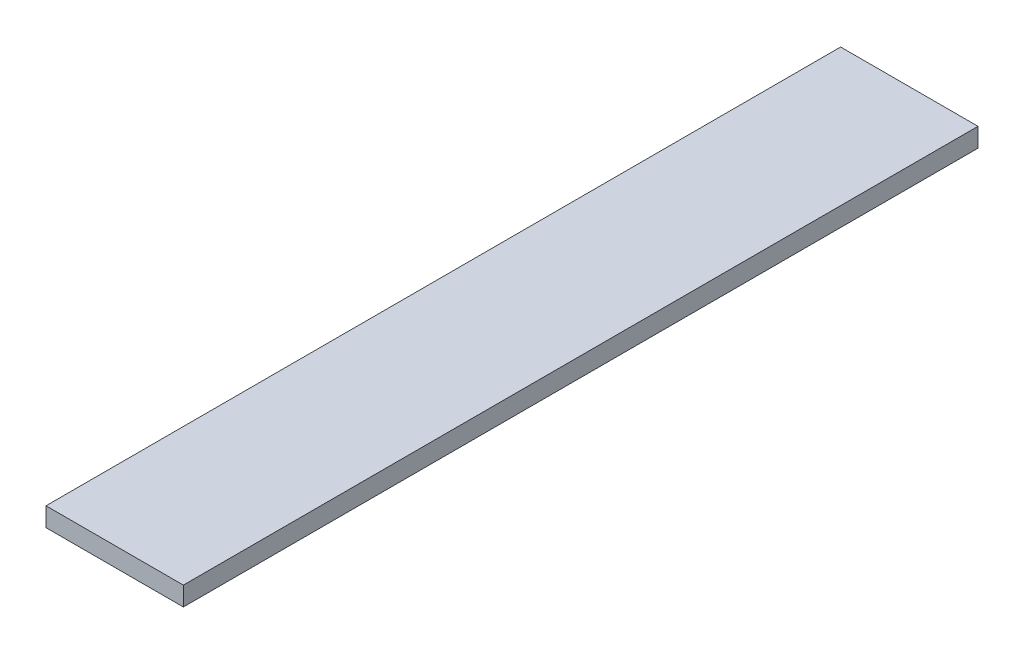
ISO-10303-21;
HEADER;
FILE_DESCRIPTION(('STEP AP214'),'2;1');
FILE_NAME('part.step','',(''),(''),'','','');
FILE_SCHEMA(('AUTOMOTIVE_DESIGN { 1 0 10303 214 1 1 1 1 }'));
ENDSEC;
DATA;
#1=APPLICATION_CONTEXT('core data for automotive mechanical design processes');
#2=APPLICATION_PROTOCOL_DEFINITION('international standard','automotive_design',2000,#1);
#3=PRODUCT_CONTEXT('',#1,'mechanical');
#4=PRODUCT('Part','Part','',(#3));
#5=PRODUCT_RELATED_PRODUCT_CATEGORY('part','',(#4));
#6=PRODUCT_DEFINITION_FORMATION('','',#4);
#7=PRODUCT_DEFINITION_CONTEXT('part definition',#1,'design');
#8=PRODUCT_DEFINITION('design','',#6,#7);
#9=PRODUCT_DEFINITION_SHAPE('','',#8);
#10=(LENGTH_UNIT() NAMED_UNIT(*) SI_UNIT(.MILLI.,.METRE.));
#11=(NAMED_UNIT(*) PLANE_ANGLE_UNIT() SI_UNIT($,.RADIAN.));
#12=(NAMED_UNIT(*) SI_UNIT($,.STERADIAN.) SOLID_ANGLE_UNIT());
#13=UNCERTAINTY_MEASURE_WITH_UNIT(LENGTH_MEASURE(1.E-05),#10,'distance_accuracy_value','');
#14=(GEOMETRIC_REPRESENTATION_CONTEXT(3) GLOBAL_UNCERTAINTY_ASSIGNED_CONTEXT((#13)) GLOBAL_UNIT_ASSIGNED_CONTEXT((#10,
#11,#12)) REPRESENTATION_CONTEXT('',''));
#15=CARTESIAN_POINT('',(0.,0.,0.));
#16=DIRECTION('',(0.,0.,1.));
#17=DIRECTION('',(1.,0.,0.));
#18=AXIS2_PLACEMENT_3D('',#15,#16,#17);
#19=CARTESIAN_POINT('',(-36.18,10.,-209.31));
#20=DIRECTION('',(1.,0.,0.));
#21=DIRECTION('',(0.,0.,-1.));
#22=AXIS2_PLACEMENT_3D('',#19,#20,#21);
#23=PLANE('',#22);
#24=DIRECTION('',(0.,0.,1.));
#25=VECTOR('',#24,1.);
#26=CARTESIAN_POINT('',(-36.18,0.,-209.31));
#27=LINE('',#26,#25);
#28=CARTESIAN_POINT('',(-36.18,0.,-209.31));
#29=VERTEX_POINT('',#28);
#30=CARTESIAN_POINT('',(-36.18,0.,209.31));
#31=VERTEX_POINT('',#30);
#32=EDGE_CURVE('E107',#29,#31,#27,.T.);
#33=ORIENTED_EDGE('',*,*,#32,.T.);
#34=DIRECTION('',(0.,-1.,0.));
#35=VECTOR('',#34,1.);
#36=CARTESIAN_POINT('',(-36.18,10.,209.31));
#37=LINE('',#36,#35);
#38=CARTESIAN_POINT('',(-36.18,10.,209.31));
#39=VERTEX_POINT('',#38);
#40=EDGE_CURVE('E11',#39,#31,#37,.T.);
#41=ORIENTED_EDGE('',*,*,#40,.F.);
#42=DIRECTION('',(0.,0.,1.));
#43=VECTOR('',#42,1.);
#44=CARTESIAN_POINT('',(-36.18,10.,-209.31));
#45=LINE('',#44,#43);
#46=CARTESIAN_POINT('',(-36.18,10.,-209.31));
#47=VERTEX_POINT('',#46);
#48=EDGE_CURVE('E91',#47,#39,#45,.T.);
#49=ORIENTED_EDGE('',*,*,#48,.F.);
#50=DIRECTION('',(0.,-1.,0.));
#51=VECTOR('',#50,1.);
#52=CARTESIAN_POINT('',(-36.18,10.,-209.31));
#53=LINE('',#52,#51);
#54=EDGE_CURVE('E103',#47,#29,#53,.T.);
#55=ORIENTED_EDGE('',*,*,#54,.T.);
#56=EDGE_LOOP('',(#33,#41,#49,#55));
#57=FACE_BOUND('',#56,.T.);
#58=ADVANCED_FACE('F39',(#57),#23,.F.);
#59=CARTESIAN_POINT('',(36.18,10.,209.31));
#60=DIRECTION('',(0.,0.,-1.));
#61=DIRECTION('',(-1.,0.,0.));
#62=AXIS2_PLACEMENT_3D('',#59,#60,#61);
#63=PLANE('',#62);
#64=DIRECTION('',(1.,0.,0.));
#65=VECTOR('',#64,1.);
#66=CARTESIAN_POINT('',(36.18,0.,209.31));
#67=LINE('',#66,#65);
#68=CARTESIAN_POINT('',(36.18,0.,209.31));
#69=VERTEX_POINT('',#68);
#70=EDGE_CURVE('E96',#31,#69,#67,.T.);
#71=ORIENTED_EDGE('',*,*,#70,.T.);
#72=DIRECTION('',(0.,-1.,0.));
#73=VECTOR('',#72,1.);
#74=CARTESIAN_POINT('',(36.18,10.,209.31));
#75=LINE('',#74,#73);
#76=CARTESIAN_POINT('',(36.18,10.,209.31));
#77=VERTEX_POINT('',#76);
#78=EDGE_CURVE('E48',#77,#69,#75,.T.);
#79=ORIENTED_EDGE('',*,*,#78,.F.);
#80=DIRECTION('',(1.,0.,0.));
#81=VECTOR('',#80,1.);
#82=CARTESIAN_POINT('',(36.18,10.,209.31));
#83=LINE('',#82,#81);
#84=EDGE_CURVE('E86',#39,#77,#83,.T.);
#85=ORIENTED_EDGE('',*,*,#84,.F.);
#86=ORIENTED_EDGE('',*,*,#40,.T.);
#87=EDGE_LOOP('',(#71,#79,#85,#86));
#88=FACE_BOUND('',#87,.T.);
#89=ADVANCED_FACE('F95',(#88),#63,.F.);
#90=CARTESIAN_POINT('',(36.18,10.,-209.31));
#91=DIRECTION('',(-1.,0.,0.));
#92=DIRECTION('',(0.,0.,1.));
#93=AXIS2_PLACEMENT_3D('',#90,#91,#92);
#94=PLANE('',#93);
#95=DIRECTION('',(0.,0.,-1.));
#96=VECTOR('',#95,1.);
#97=CARTESIAN_POINT('',(36.18,0.,-209.31));
#98=LINE('',#97,#96);
#99=CARTESIAN_POINT('',(36.18,0.,-209.31));
#100=VERTEX_POINT('',#99);
#101=EDGE_CURVE('E73',#69,#100,#98,.T.);
#102=ORIENTED_EDGE('',*,*,#101,.T.);
#103=DIRECTION('',(0.,-1.,0.));
#104=VECTOR('',#103,1.);
#105=CARTESIAN_POINT('',(36.18,10.,-209.31));
#106=LINE('',#105,#104);
#107=CARTESIAN_POINT('',(36.18,10.,-209.31));
#108=VERTEX_POINT('',#107);
#109=EDGE_CURVE('E98',#108,#100,#106,.T.);
#110=ORIENTED_EDGE('',*,*,#109,.F.);
#111=DIRECTION('',(0.,0.,-1.));
#112=VECTOR('',#111,1.);
#113=CARTESIAN_POINT('',(36.18,10.,-209.31));
#114=LINE('',#113,#112);
#115=EDGE_CURVE('E89',#77,#108,#114,.T.);
#116=ORIENTED_EDGE('',*,*,#115,.F.);
#117=ORIENTED_EDGE('',*,*,#78,.T.);
#118=EDGE_LOOP('',(#102,#110,#116,#117));
#119=FACE_BOUND('',#118,.T.);
#120=ADVANCED_FACE('F99',(#119),#94,.F.);
#121=CARTESIAN_POINT('',(36.18,10.,-209.31));
#122=DIRECTION('',(0.,0.,1.));
#123=DIRECTION('',(1.,0.,0.));
#124=AXIS2_PLACEMENT_3D('',#121,#122,#123);
#125=PLANE('',#124);
#126=DIRECTION('',(-1.,0.,0.));
#127=VECTOR('',#126,1.);
#128=CARTESIAN_POINT('',(36.18,0.,-209.31));
#129=LINE('',#128,#127);
#130=EDGE_CURVE('E79',#100,#29,#129,.T.);
#131=ORIENTED_EDGE('',*,*,#130,.T.);
#132=ORIENTED_EDGE('',*,*,#54,.F.);
#133=DIRECTION('',(-1.,0.,0.));
#134=VECTOR('',#133,1.);
#135=CARTESIAN_POINT('',(36.18,10.,-209.31));
#136=LINE('',#135,#134);
#137=EDGE_CURVE('E56',#108,#47,#136,.T.);
#138=ORIENTED_EDGE('',*,*,#137,.F.);
#139=ORIENTED_EDGE('',*,*,#109,.T.);
#140=EDGE_LOOP('',(#131,#132,#138,#139));
#141=FACE_BOUND('',#140,.T.);
#142=ADVANCED_FACE('F120',(#141),#125,.F.);
#143=CARTESIAN_POINT('',(0.,10.,0.));
#144=DIRECTION('',(0.,-1.,0.));
#145=DIRECTION('',(0.,0.,-1.));
#146=AXIS2_PLACEMENT_3D('',#143,#144,#145);
#147=PLANE('',#146);
#148=ORIENTED_EDGE('',*,*,#48,.T.);
#149=ORIENTED_EDGE('',*,*,#84,.T.);
#150=ORIENTED_EDGE('',*,*,#115,.T.);
#151=ORIENTED_EDGE('',*,*,#137,.T.);
#152=EDGE_LOOP('',(#148,#149,#150,#151));
#153=FACE_BOUND('',#152,.T.);
#154=ADVANCED_FACE('F87',(#153),#147,.F.);
#155=CARTESIAN_POINT('',(0.,0.,0.));
#156=DIRECTION('',(0.,-1.,0.));
#157=DIRECTION('',(0.,0.,-1.));
#158=AXIS2_PLACEMENT_3D('',#155,#156,#157);
#159=PLANE('',#158);
#160=ORIENTED_EDGE('',*,*,#32,.F.);
#161=ORIENTED_EDGE('',*,*,#130,.F.);
#162=ORIENTED_EDGE('',*,*,#101,.F.);
#163=ORIENTED_EDGE('',*,*,#70,.F.);
#164=EDGE_LOOP('',(#160,#161,#162,#163));
#165=FACE_BOUND('',#164,.T.);
#166=ADVANCED_FACE('F123',(#165),#159,.T.);
#167=CLOSED_SHELL('',(#58,#89,#120,#142,#154,#166));
#168=MANIFOLD_SOLID_BREP('B2',#167);
#169=ADVANCED_BREP_SHAPE_REPRESENTATION('',(#18,#168),#14);
#170=SHAPE_DEFINITION_REPRESENTATION(#9,#169);
ENDSEC;
END-ISO-10303-21;
